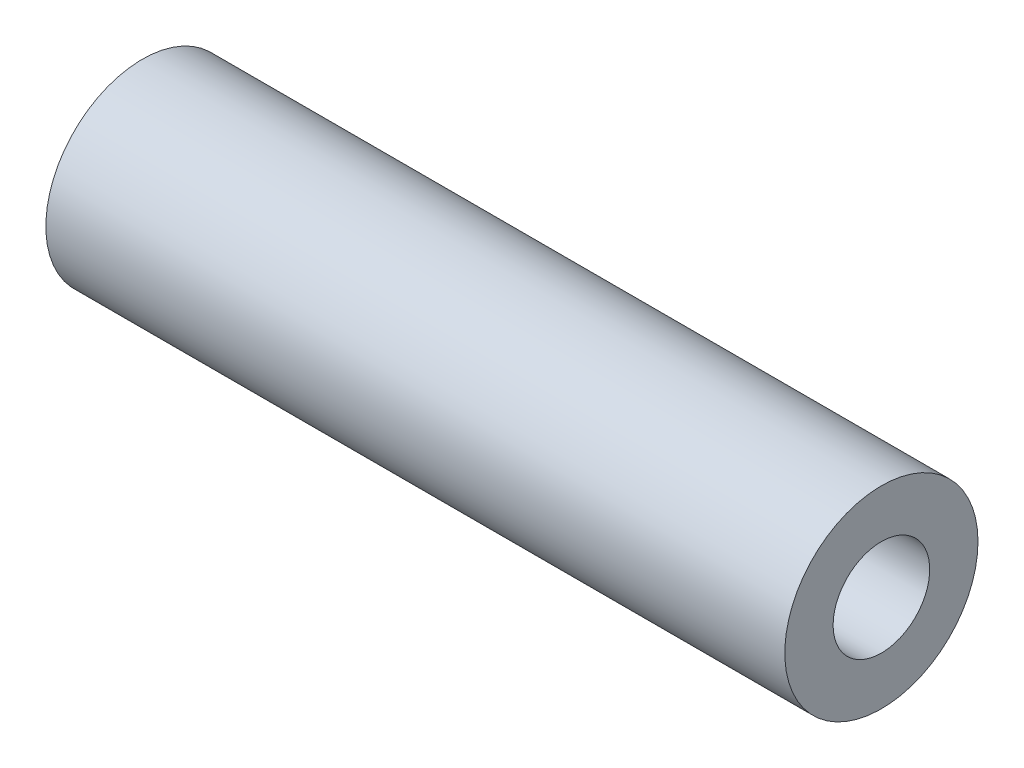
ISO-10303-21;
HEADER;
FILE_DESCRIPTION(('STEP AP214'),'2;1');
FILE_NAME('part.step','',(''),(''),'','','');
FILE_SCHEMA(('AUTOMOTIVE_DESIGN { 1 0 10303 214 1 1 1 1 }'));
ENDSEC;
DATA;
#1=APPLICATION_CONTEXT('core data for automotive mechanical design processes');
#2=APPLICATION_PROTOCOL_DEFINITION('international standard','automotive_design',2000,#1);
#3=PRODUCT_CONTEXT('',#1,'mechanical');
#4=PRODUCT('Part','Part','',(#3));
#5=PRODUCT_RELATED_PRODUCT_CATEGORY('part','',(#4));
#6=PRODUCT_DEFINITION_FORMATION('','',#4);
#7=PRODUCT_DEFINITION_CONTEXT('part definition',#1,'design');
#8=PRODUCT_DEFINITION('design','',#6,#7);
#9=PRODUCT_DEFINITION_SHAPE('','',#8);
#10=(LENGTH_UNIT() NAMED_UNIT(*) SI_UNIT(.MILLI.,.METRE.));
#11=(NAMED_UNIT(*) PLANE_ANGLE_UNIT() SI_UNIT($,.RADIAN.));
#12=(NAMED_UNIT(*) SI_UNIT($,.STERADIAN.) SOLID_ANGLE_UNIT());
#13=UNCERTAINTY_MEASURE_WITH_UNIT(LENGTH_MEASURE(1.E-05),#10,'distance_accuracy_value','');
#14=(GEOMETRIC_REPRESENTATION_CONTEXT(3) GLOBAL_UNCERTAINTY_ASSIGNED_CONTEXT((#13)) GLOBAL_UNIT_ASSIGNED_CONTEXT((#10,
#11,#12)) REPRESENTATION_CONTEXT('',''));
#15=CARTESIAN_POINT('',(0.,0.,0.));
#16=DIRECTION('',(0.,0.,1.));
#17=DIRECTION('',(1.,0.,0.));
#18=AXIS2_PLACEMENT_3D('',#15,#16,#17);
#19=CARTESIAN_POINT('',(38.25,0.,0.));
#20=DIRECTION('',(-1.,0.,0.));
#21=DIRECTION('',(0.,0.,1.));
#22=AXIS2_PLACEMENT_3D('',#19,#20,#21);
#23=CYLINDRICAL_SURFACE('',#22,5.);
#24=CARTESIAN_POINT('',(38.25,0.,0.));
#25=DIRECTION('',(1.,0.,0.));
#26=DIRECTION('',(0.,0.,-1.));
#27=AXIS2_PLACEMENT_3D('',#24,#25,#26);
#28=CIRCLE('',#27,5.);
#29=CARTESIAN_POINT('',(38.25,0.,-5.));
#30=VERTEX_POINT('',#29);
#31=EDGE_CURVE('E10',#30,#30,#28,.T.);
#32=ORIENTED_EDGE('',*,*,#31,.F.);
#33=EDGE_LOOP('',(#32));
#34=FACE_BOUND('',#33,.T.);
#35=CARTESIAN_POINT('',(0.,0.,0.));
#36=DIRECTION('',(1.,0.,0.));
#37=DIRECTION('',(0.,0.,-1.));
#38=AXIS2_PLACEMENT_3D('',#35,#36,#37);
#39=CIRCLE('',#38,5.);
#40=CARTESIAN_POINT('',(0.,0.,-5.));
#41=VERTEX_POINT('',#40);
#42=EDGE_CURVE('E42',#41,#41,#39,.T.);
#43=ORIENTED_EDGE('',*,*,#42,.T.);
#44=EDGE_LOOP('',(#43));
#45=FACE_BOUND('',#44,.T.);
#46=ADVANCED_FACE('F39',(#34,#45),#23,.T.);
#47=CARTESIAN_POINT('',(38.25,0.,0.));
#48=DIRECTION('',(1.,0.,0.));
#49=DIRECTION('',(0.,0.,-1.));
#50=AXIS2_PLACEMENT_3D('',#47,#48,#49);
#51=PLANE('',#50);
#52=CARTESIAN_POINT('',(38.25,0.,0.));
#53=DIRECTION('',(-1.,0.,0.));
#54=DIRECTION('',(0.,0.,1.));
#55=AXIS2_PLACEMENT_3D('',#52,#53,#54);
#56=CIRCLE('',#55,2.49999999999999);
#57=CARTESIAN_POINT('',(38.25,0.,2.49999999999999));
#58=VERTEX_POINT('',#57);
#59=EDGE_CURVE('E49',#58,#58,#56,.T.);
#60=ORIENTED_EDGE('',*,*,#59,.T.);
#61=EDGE_LOOP('',(#60));
#62=FACE_BOUND('',#61,.T.);
#63=ORIENTED_EDGE('',*,*,#31,.T.);
#64=EDGE_LOOP('',(#63));
#65=FACE_BOUND('',#64,.T.);
#66=ADVANCED_FACE('F62',(#62,#65),#51,.T.);
#67=CARTESIAN_POINT('',(0.,0.,0.));
#68=DIRECTION('',(1.,0.,0.));
#69=DIRECTION('',(0.,0.,-1.));
#70=AXIS2_PLACEMENT_3D('',#67,#68,#69);
#71=PLANE('',#70);
#72=CARTESIAN_POINT('',(0.,0.,0.));
#73=DIRECTION('',(-1.,0.,0.));
#74=DIRECTION('',(0.,0.,1.));
#75=AXIS2_PLACEMENT_3D('',#72,#73,#74);
#76=CIRCLE('',#75,2.5);
#77=CARTESIAN_POINT('',(0.,0.,2.5));
#78=VERTEX_POINT('',#77);
#79=EDGE_CURVE('E53',#78,#78,#76,.T.);
#80=ORIENTED_EDGE('',*,*,#79,.F.);
#81=EDGE_LOOP('',(#80));
#82=FACE_BOUND('',#81,.T.);
#83=ORIENTED_EDGE('',*,*,#42,.F.);
#84=EDGE_LOOP('',(#83));
#85=FACE_BOUND('',#84,.T.);
#86=ADVANCED_FACE('F59',(#82,#85),#71,.F.);
#87=CARTESIAN_POINT('',(0.,0.,0.));
#88=DIRECTION('',(-1.,0.,0.));
#89=DIRECTION('',(0.,0.,1.));
#90=AXIS2_PLACEMENT_3D('',#87,#88,#89);
#91=CYLINDRICAL_SURFACE('',#90,2.49999999999999);
#92=ORIENTED_EDGE('',*,*,#59,.F.);
#93=EDGE_LOOP('',(#92));
#94=FACE_BOUND('',#93,.T.);
#95=ORIENTED_EDGE('',*,*,#79,.T.);
#96=EDGE_LOOP('',(#95));
#97=FACE_BOUND('',#96,.T.);
#98=ADVANCED_FACE('F57',(#94,#97),#91,.F.);
#99=CLOSED_SHELL('',(#46,#66,#86,#98));
#100=MANIFOLD_SOLID_BREP('B2',#99);
#101=ADVANCED_BREP_SHAPE_REPRESENTATION('',(#18,#100),#14);
#102=SHAPE_DEFINITION_REPRESENTATION(#9,#101);
ENDSEC;
END-ISO-10303-21;
